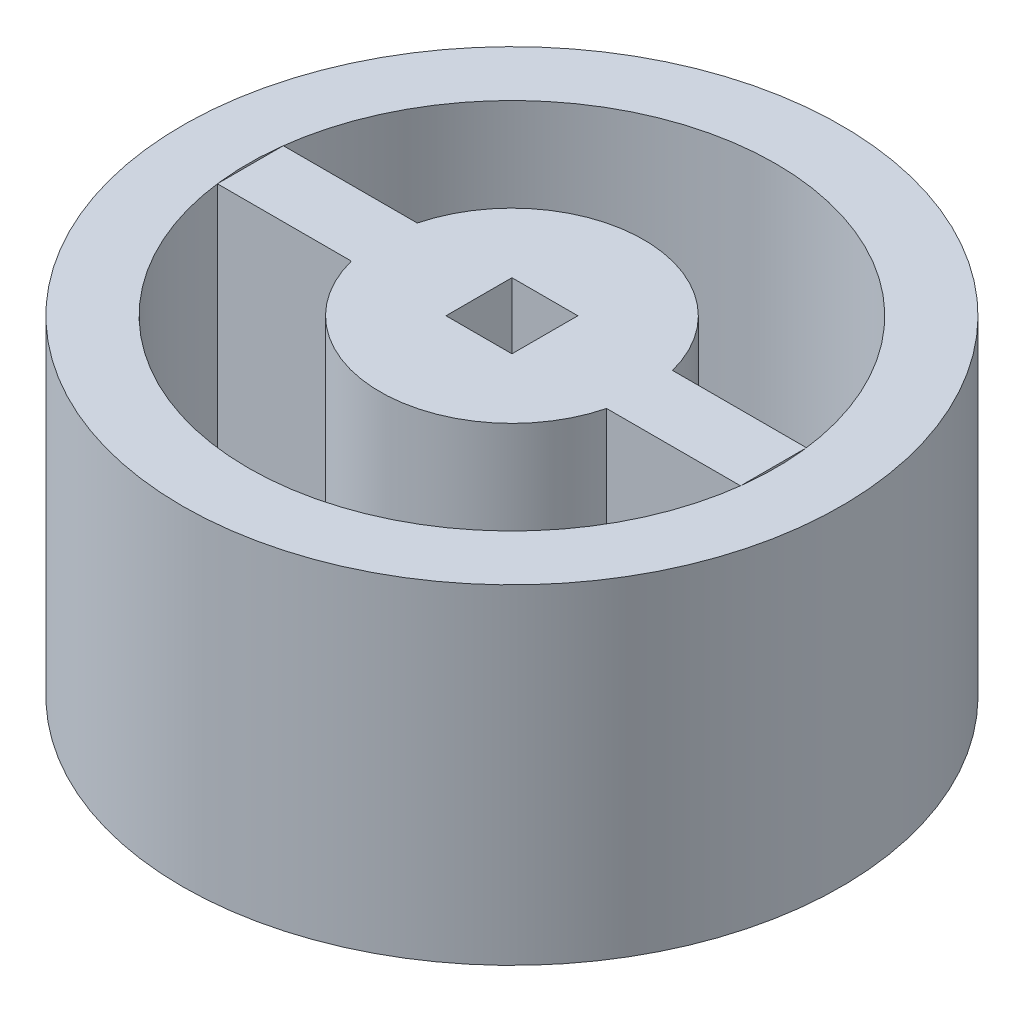
ISO-10303-21;
HEADER;
FILE_DESCRIPTION(('STEP AP214'),'2;1');
FILE_NAME('part.step','',(''),(''),'','','');
FILE_SCHEMA(('AUTOMOTIVE_DESIGN { 1 0 10303 214 1 1 1 1 }'));
ENDSEC;
DATA;
#1=APPLICATION_CONTEXT('core data for automotive mechanical design processes');
#2=APPLICATION_PROTOCOL_DEFINITION('international standard','automotive_design',2000,#1);
#3=PRODUCT_CONTEXT('',#1,'mechanical');
#4=PRODUCT('Part','Part','',(#3));
#5=PRODUCT_RELATED_PRODUCT_CATEGORY('part','',(#4));
#6=PRODUCT_DEFINITION_FORMATION('','',#4);
#7=PRODUCT_DEFINITION_CONTEXT('part definition',#1,'design');
#8=PRODUCT_DEFINITION('design','',#6,#7);
#9=PRODUCT_DEFINITION_SHAPE('','',#8);
#10=(LENGTH_UNIT() NAMED_UNIT(*) SI_UNIT(.MILLI.,.METRE.));
#11=(NAMED_UNIT(*) PLANE_ANGLE_UNIT() SI_UNIT($,.RADIAN.));
#12=(NAMED_UNIT(*) SI_UNIT($,.STERADIAN.) SOLID_ANGLE_UNIT());
#13=UNCERTAINTY_MEASURE_WITH_UNIT(LENGTH_MEASURE(1.E-05),#10,'distance_accuracy_value','');
#14=(GEOMETRIC_REPRESENTATION_CONTEXT(3) GLOBAL_UNCERTAINTY_ASSIGNED_CONTEXT((#13)) GLOBAL_UNIT_ASSIGNED_CONTEXT((#10,
#11,#12)) REPRESENTATION_CONTEXT('',''));
#15=CARTESIAN_POINT('',(0.,0.,0.));
#16=DIRECTION('',(0.,0.,1.));
#17=DIRECTION('',(1.,0.,0.));
#18=AXIS2_PLACEMENT_3D('',#15,#16,#17);
#19=CARTESIAN_POINT('',(0.,5.,0.));
#20=DIRECTION('',(0.,1.,0.));
#21=DIRECTION('',(0.,0.,1.));
#22=AXIS2_PLACEMENT_3D('',#19,#20,#21);
#23=PLANE('',#22);
#24=CARTESIAN_POINT('',(0.,5.,0.));
#25=DIRECTION('',(0.,-1.,0.));
#26=DIRECTION('',(0.,0.,-1.));
#27=AXIS2_PLACEMENT_3D('',#24,#25,#26);
#28=CIRCLE('',#27,4.);
#29=CARTESIAN_POINT('',(0.,5.,-4.));
#30=VERTEX_POINT('',#29);
#31=EDGE_CURVE('E51',#30,#30,#28,.T.);
#32=ORIENTED_EDGE('',*,*,#31,.T.);
#33=EDGE_LOOP('',(#32));
#34=FACE_BOUND('',#33,.T.);
#35=CARTESIAN_POINT('',(0.,5.,0.));
#36=DIRECTION('',(0.,1.,0.));
#37=DIRECTION('',(0.,0.,1.));
#38=AXIS2_PLACEMENT_3D('',#35,#36,#37);
#39=CIRCLE('',#38,5.);
#40=CARTESIAN_POINT('',(0.,5.,5.));
#41=VERTEX_POINT('',#40);
#42=EDGE_CURVE('E62',#41,#41,#39,.T.);
#43=ORIENTED_EDGE('',*,*,#42,.T.);
#44=EDGE_LOOP('',(#43));
#45=FACE_BOUND('',#44,.T.);
#46=ADVANCED_FACE('F47',(#34,#45),#23,.T.);
#47=CARTESIAN_POINT('',(0.,0.,0.));
#48=DIRECTION('',(0.,1.,0.));
#49=DIRECTION('',(0.,0.,1.));
#50=AXIS2_PLACEMENT_3D('',#47,#48,#49);
#51=PLANE('',#50);
#52=CARTESIAN_POINT('',(0.,0.,0.));
#53=DIRECTION('',(0.,1.,0.));
#54=DIRECTION('',(0.,0.,1.));
#55=AXIS2_PLACEMENT_3D('',#52,#53,#54);
#56=CIRCLE('',#55,4.);
#57=CARTESIAN_POINT('',(0.,0.,4.));
#58=VERTEX_POINT('',#57);
#59=EDGE_CURVE('E56',#58,#58,#56,.T.);
#60=ORIENTED_EDGE('',*,*,#59,.T.);
#61=EDGE_LOOP('',(#60));
#62=FACE_BOUND('',#61,.T.);
#63=CARTESIAN_POINT('',(0.,0.,0.));
#64=DIRECTION('',(0.,1.,0.));
#65=DIRECTION('',(0.,0.,1.));
#66=AXIS2_PLACEMENT_3D('',#63,#64,#65);
#67=CIRCLE('',#66,5.);
#68=CARTESIAN_POINT('',(0.,0.,5.));
#69=VERTEX_POINT('',#68);
#70=EDGE_CURVE('E11',#69,#69,#67,.T.);
#71=ORIENTED_EDGE('',*,*,#70,.F.);
#72=EDGE_LOOP('',(#71));
#73=FACE_BOUND('',#72,.T.);
#74=ADVANCED_FACE('F49',(#62,#73),#51,.F.);
#75=CARTESIAN_POINT('',(0.,5.,0.));
#76=DIRECTION('',(0.,-1.,0.));
#77=DIRECTION('',(0.,0.,-1.));
#78=AXIS2_PLACEMENT_3D('',#75,#76,#77);
#79=CYLINDRICAL_SURFACE('',#78,5.);
#80=ORIENTED_EDGE('',*,*,#42,.F.);
#81=EDGE_LOOP('',(#80));
#82=FACE_BOUND('',#81,.T.);
#83=ORIENTED_EDGE('',*,*,#70,.T.);
#84=EDGE_LOOP('',(#83));
#85=FACE_BOUND('',#84,.T.);
#86=ADVANCED_FACE('F75',(#82,#85),#79,.T.);
#87=CARTESIAN_POINT('',(0.,5.,0.));
#88=DIRECTION('',(0.,-1.,0.));
#89=DIRECTION('',(0.,0.,-1.));
#90=AXIS2_PLACEMENT_3D('',#87,#88,#89);
#91=CYLINDRICAL_SURFACE('',#90,4.);
#92=ORIENTED_EDGE('',*,*,#59,.F.);
#93=EDGE_LOOP('',(#92));
#94=FACE_BOUND('',#93,.T.);
#95=ORIENTED_EDGE('',*,*,#31,.F.);
#96=EDGE_LOOP('',(#95));
#97=FACE_BOUND('',#96,.T.);
#98=ADVANCED_FACE('F73',(#94,#97),#91,.F.);
#99=CLOSED_SHELL('',(#46,#74,#86,#98));
#100=MANIFOLD_SOLID_BREP('B2',#99);
#101=CARTESIAN_POINT('',(-3.96862696659689,0.,0.5));
#102=DIRECTION('',(0.,0.,1.));
#103=DIRECTION('',(1.,0.,0.));
#104=AXIS2_PLACEMENT_3D('',#101,#102,#103);
#105=PLANE('',#104);
#106=DIRECTION('',(1.,0.,0.));
#107=VECTOR('',#106,1.);
#108=CARTESIAN_POINT('',(-3.96862696659689,0.,0.5));
#109=LINE('',#108,#107);
#110=CARTESIAN_POINT('',(-3.96862696659689,0.,0.5));
#111=VERTEX_POINT('',#110);
#112=CARTESIAN_POINT('',(-1.93649167310371,0.,0.5));
#113=VERTEX_POINT('',#112);
#114=EDGE_CURVE('E244',#111,#113,#109,.T.);
#115=ORIENTED_EDGE('',*,*,#114,.T.);
#116=DIRECTION('',(0.,-1.,0.));
#117=VECTOR('',#116,1.);
#118=CARTESIAN_POINT('',(-1.93649167310371,5.,0.5));
#119=LINE('',#118,#117);
#120=CARTESIAN_POINT('',(-1.93649167310371,5.,0.5));
#121=VERTEX_POINT('',#120);
#122=EDGE_CURVE('E45',#113,#121,#119,.F.);
#123=ORIENTED_EDGE('',*,*,#122,.T.);
#124=DIRECTION('',(1.,0.,0.));
#125=VECTOR('',#124,1.);
#126=CARTESIAN_POINT('',(-3.96862696659689,5.,0.5));
#127=LINE('',#126,#125);
#128=CARTESIAN_POINT('',(-3.96862696659689,5.,0.5));
#129=VERTEX_POINT('',#128);
#130=EDGE_CURVE('E236',#129,#121,#127,.T.);
#131=ORIENTED_EDGE('',*,*,#130,.F.);
#132=DIRECTION('',(0.,1.,0.));
#133=VECTOR('',#132,1.);
#134=CARTESIAN_POINT('',(-3.96862696659689,0.,0.5));
#135=LINE('',#134,#133);
#136=EDGE_CURVE('E264',#111,#129,#135,.T.);
#137=ORIENTED_EDGE('',*,*,#136,.F.);
#138=EDGE_LOOP('',(#115,#123,#131,#137));
#139=FACE_BOUND('',#138,.T.);
#140=ADVANCED_FACE('F107',(#139),#105,.T.);
#141=CARTESIAN_POINT('',(-3.96862696659689,0.,0.5));
#142=DIRECTION('',(-1.,0.,0.));
#143=DIRECTION('',(0.,0.,1.));
#144=AXIS2_PLACEMENT_3D('',#141,#142,#143);
#145=PLANE('',#144);
#146=DIRECTION('',(0.,0.,1.));
#147=VECTOR('',#146,1.);
#148=CARTESIAN_POINT('',(-3.96862696659689,5.,0.5));
#149=LINE('',#148,#147);
#150=CARTESIAN_POINT('',(-3.96862696659689,5.,-0.5));
#151=VERTEX_POINT('',#150);
#152=EDGE_CURVE('E254',#151,#129,#149,.T.);
#153=ORIENTED_EDGE('',*,*,#152,.F.);
#154=DIRECTION('',(0.,1.,0.));
#155=VECTOR('',#154,1.);
#156=CARTESIAN_POINT('',(-3.96862696659689,0.,-0.5));
#157=LINE('',#156,#155);
#158=CARTESIAN_POINT('',(-3.96862696659689,0.,-0.5));
#159=VERTEX_POINT('',#158);
#160=EDGE_CURVE('E266',#159,#151,#157,.T.);
#161=ORIENTED_EDGE('',*,*,#160,.F.);
#162=DIRECTION('',(0.,0.,1.));
#163=VECTOR('',#162,1.);
#164=CARTESIAN_POINT('',(-3.96862696659689,0.,0.5));
#165=LINE('',#164,#163);
#166=EDGE_CURVE('E240',#159,#111,#165,.T.);
#167=ORIENTED_EDGE('',*,*,#166,.T.);
#168=ORIENTED_EDGE('',*,*,#136,.T.);
#169=EDGE_LOOP('',(#153,#161,#167,#168));
#170=FACE_BOUND('',#169,.T.);
#171=ADVANCED_FACE('F307',(#170),#145,.T.);
#172=CARTESIAN_POINT('',(-3.96862696659689,0.,-0.5));
#173=DIRECTION('',(0.,0.,-1.));
#174=DIRECTION('',(-1.,0.,0.));
#175=AXIS2_PLACEMENT_3D('',#172,#173,#174);
#176=PLANE('',#175);
#177=DIRECTION('',(-1.,0.,0.));
#178=VECTOR('',#177,1.);
#179=CARTESIAN_POINT('',(-3.96862696659689,5.,-0.5));
#180=LINE('',#179,#178);
#181=CARTESIAN_POINT('',(-1.93649167310371,5.,-0.5));
#182=VERTEX_POINT('',#181);
#183=EDGE_CURVE('E250',#182,#151,#180,.T.);
#184=ORIENTED_EDGE('',*,*,#183,.F.);
#185=DIRECTION('',(0.,-1.,0.));
#186=VECTOR('',#185,1.);
#187=CARTESIAN_POINT('',(-1.93649167310371,5.,-0.5));
#188=LINE('',#187,#186);
#189=CARTESIAN_POINT('',(-1.93649167310371,0.,-0.5));
#190=VERTEX_POINT('',#189);
#191=EDGE_CURVE('E275',#182,#190,#188,.T.);
#192=ORIENTED_EDGE('',*,*,#191,.T.);
#193=DIRECTION('',(-1.,0.,0.));
#194=VECTOR('',#193,1.);
#195=CARTESIAN_POINT('',(-3.96862696659689,0.,-0.5));
#196=LINE('',#195,#194);
#197=EDGE_CURVE('E235',#190,#159,#196,.T.);
#198=ORIENTED_EDGE('',*,*,#197,.T.);
#199=ORIENTED_EDGE('',*,*,#160,.T.);
#200=EDGE_LOOP('',(#184,#192,#198,#199));
#201=FACE_BOUND('',#200,.T.);
#202=ADVANCED_FACE('F310',(#201),#176,.T.);
#203=CARTESIAN_POINT('',(0.,5.,0.));
#204=DIRECTION('',(0.,-1.,0.));
#205=DIRECTION('',(0.,0.,-1.));
#206=AXIS2_PLACEMENT_3D('',#203,#204,#205);
#207=CYLINDRICAL_SURFACE('',#206,2.);
#208=ORIENTED_EDGE('',*,*,#122,.F.);
#209=CARTESIAN_POINT('',(0.,0.,0.));
#210=DIRECTION('',(0.,1.,0.));
#211=DIRECTION('',(0.,0.,1.));
#212=AXIS2_PLACEMENT_3D('',#209,#210,#211);
#213=CIRCLE('',#212,2.);
#214=CARTESIAN_POINT('',(1.93649167310371,0.,0.5));
#215=VERTEX_POINT('',#214);
#216=EDGE_CURVE('E272',#113,#215,#213,.T.);
#217=ORIENTED_EDGE('',*,*,#216,.T.);
#218=DIRECTION('',(0.,-1.,0.));
#219=VECTOR('',#218,1.);
#220=CARTESIAN_POINT('',(1.93649167310371,5.,0.5));
#221=LINE('',#220,#219);
#222=CARTESIAN_POINT('',(1.93649167310371,5.,0.5));
#223=VERTEX_POINT('',#222);
#224=EDGE_CURVE('E115',#223,#215,#221,.T.);
#225=ORIENTED_EDGE('',*,*,#224,.F.);
#226=CARTESIAN_POINT('',(0.,5.,0.));
#227=DIRECTION('',(0.,-1.,0.));
#228=DIRECTION('',(0.,0.,-1.));
#229=AXIS2_PLACEMENT_3D('',#226,#227,#228);
#230=CIRCLE('',#229,2.);
#231=EDGE_CURVE('E271',#223,#121,#230,.T.);
#232=ORIENTED_EDGE('',*,*,#231,.T.);
#233=EDGE_LOOP('',(#208,#217,#225,#232));
#234=FACE_BOUND('',#233,.T.);
#235=ADVANCED_FACE('F300',(#234),#207,.T.);
#236=CARTESIAN_POINT('',(0.,5.,0.));
#237=DIRECTION('',(0.,1.,0.));
#238=DIRECTION('',(0.,0.,1.));
#239=AXIS2_PLACEMENT_3D('',#236,#237,#238);
#240=PLANE('',#239);
#241=DIRECTION('',(0.,0.,-1.));
#242=VECTOR('',#241,1.);
#243=CARTESIAN_POINT('',(0.5,5.,0.));
#244=LINE('',#243,#242);
#245=CARTESIAN_POINT('',(0.5,5.,0.5));
#246=VERTEX_POINT('',#245);
#247=CARTESIAN_POINT('',(0.5,5.,-0.5));
#248=VERTEX_POINT('',#247);
#249=EDGE_CURVE('E202',#246,#248,#244,.T.);
#250=ORIENTED_EDGE('',*,*,#249,.F.);
#251=DIRECTION('',(1.,0.,0.));
#252=VECTOR('',#251,1.);
#253=CARTESIAN_POINT('',(0.,5.,0.5));
#254=LINE('',#253,#252);
#255=CARTESIAN_POINT('',(-0.5,5.,0.5));
#256=VERTEX_POINT('',#255);
#257=EDGE_CURVE('E228',#256,#246,#254,.T.);
#258=ORIENTED_EDGE('',*,*,#257,.F.);
#259=DIRECTION('',(0.,0.,1.));
#260=VECTOR('',#259,1.);
#261=CARTESIAN_POINT('',(-0.5,5.,0.));
#262=LINE('',#261,#260);
#263=CARTESIAN_POINT('',(-0.5,5.,-0.5));
#264=VERTEX_POINT('',#263);
#265=EDGE_CURVE('E226',#264,#256,#262,.T.);
#266=ORIENTED_EDGE('',*,*,#265,.F.);
#267=DIRECTION('',(-1.,0.,0.));
#268=VECTOR('',#267,1.);
#269=CARTESIAN_POINT('',(0.,5.,-0.5));
#270=LINE('',#269,#268);
#271=EDGE_CURVE('E220',#248,#264,#270,.T.);
#272=ORIENTED_EDGE('',*,*,#271,.F.);
#273=EDGE_LOOP('',(#250,#258,#266,#272));
#274=FACE_BOUND('',#273,.T.);
#275=ORIENTED_EDGE('',*,*,#130,.T.);
#276=ORIENTED_EDGE('',*,*,#231,.F.);
#277=CARTESIAN_POINT('',(3.96862696659689,5.,0.5));
#278=VERTEX_POINT('',#277);
#279=EDGE_CURVE('E257',#223,#278,#127,.T.);
#280=ORIENTED_EDGE('',*,*,#279,.T.);
#281=DIRECTION('',(0.,0.,-1.));
#282=VECTOR('',#281,1.);
#283=CARTESIAN_POINT('',(3.96862696659689,5.,0.5));
#284=LINE('',#283,#282);
#285=CARTESIAN_POINT('',(3.96862696659689,5.,-0.5));
#286=VERTEX_POINT('',#285);
#287=EDGE_CURVE('E231',#278,#286,#284,.T.);
#288=ORIENTED_EDGE('',*,*,#287,.T.);
#289=CARTESIAN_POINT('',(1.93649167310371,5.,-0.5));
#290=VERTEX_POINT('',#289);
#291=EDGE_CURVE('E251',#286,#290,#180,.T.);
#292=ORIENTED_EDGE('',*,*,#291,.T.);
#293=EDGE_CURVE('E263',#182,#290,#230,.T.);
#294=ORIENTED_EDGE('',*,*,#293,.F.);
#295=ORIENTED_EDGE('',*,*,#183,.T.);
#296=ORIENTED_EDGE('',*,*,#152,.T.);
#297=EDGE_LOOP('',(#275,#276,#280,#288,#292,#294,#295,#296));
#298=FACE_BOUND('',#297,.T.);
#299=ADVANCED_FACE('F298',(#274,#298),#240,.T.);
#300=CARTESIAN_POINT('',(0.,0.,0.));
#301=DIRECTION('',(0.,1.,0.));
#302=DIRECTION('',(0.,0.,1.));
#303=AXIS2_PLACEMENT_3D('',#300,#301,#302);
#304=PLANE('',#303);
#305=DIRECTION('',(1.,0.,0.));
#306=VECTOR('',#305,1.);
#307=CARTESIAN_POINT('',(-0.5,0.,0.5));
#308=LINE('',#307,#306);
#309=CARTESIAN_POINT('',(-0.5,0.,0.5));
#310=VERTEX_POINT('',#309);
#311=CARTESIAN_POINT('',(0.5,0.,0.5));
#312=VERTEX_POINT('',#311);
#313=EDGE_CURVE('E205',#310,#312,#308,.T.);
#314=ORIENTED_EDGE('',*,*,#313,.T.);
#315=DIRECTION('',(0.,0.,-1.));
#316=VECTOR('',#315,1.);
#317=CARTESIAN_POINT('',(0.5,0.,0.5));
#318=LINE('',#317,#316);
#319=CARTESIAN_POINT('',(0.5,0.,-0.5));
#320=VERTEX_POINT('',#319);
#321=EDGE_CURVE('E199',#312,#320,#318,.T.);
#322=ORIENTED_EDGE('',*,*,#321,.T.);
#323=DIRECTION('',(-1.,0.,0.));
#324=VECTOR('',#323,1.);
#325=CARTESIAN_POINT('',(-0.5,0.,-0.5));
#326=LINE('',#325,#324);
#327=CARTESIAN_POINT('',(-0.5,0.,-0.5));
#328=VERTEX_POINT('',#327);
#329=EDGE_CURVE('E208',#320,#328,#326,.T.);
#330=ORIENTED_EDGE('',*,*,#329,.T.);
#331=DIRECTION('',(0.,0.,1.));
#332=VECTOR('',#331,1.);
#333=CARTESIAN_POINT('',(-0.5,0.,0.5));
#334=LINE('',#333,#332);
#335=EDGE_CURVE('E130',#328,#310,#334,.T.);
#336=ORIENTED_EDGE('',*,*,#335,.T.);
#337=EDGE_LOOP('',(#314,#322,#330,#336));
#338=FACE_BOUND('',#337,.T.);
#339=CARTESIAN_POINT('',(1.93649167310371,0.,-0.5));
#340=VERTEX_POINT('',#339);
#341=EDGE_CURVE('E274',#340,#190,#213,.T.);
#342=ORIENTED_EDGE('',*,*,#341,.F.);
#343=CARTESIAN_POINT('',(3.96862696659689,0.,-0.5));
#344=VERTEX_POINT('',#343);
#345=EDGE_CURVE('E237',#344,#340,#196,.T.);
#346=ORIENTED_EDGE('',*,*,#345,.F.);
#347=DIRECTION('',(0.,0.,-1.));
#348=VECTOR('',#347,1.);
#349=CARTESIAN_POINT('',(3.96862696659689,0.,0.5));
#350=LINE('',#349,#348);
#351=CARTESIAN_POINT('',(3.96862696659689,0.,0.5));
#352=VERTEX_POINT('',#351);
#353=EDGE_CURVE('E232',#352,#344,#350,.T.);
#354=ORIENTED_EDGE('',*,*,#353,.F.);
#355=EDGE_CURVE('E243',#215,#352,#109,.T.);
#356=ORIENTED_EDGE('',*,*,#355,.F.);
#357=ORIENTED_EDGE('',*,*,#216,.F.);
#358=ORIENTED_EDGE('',*,*,#114,.F.);
#359=ORIENTED_EDGE('',*,*,#166,.F.);
#360=ORIENTED_EDGE('',*,*,#197,.F.);
#361=EDGE_LOOP('',(#342,#346,#354,#356,#357,#358,#359,#360));
#362=FACE_BOUND('',#361,.T.);
#363=ADVANCED_FACE('F109',(#338,#362),#304,.F.);
#364=DIRECTION('',(0.,-1.,0.));
#365=VECTOR('',#364,1.);
#366=CARTESIAN_POINT('',(1.93649167310371,5.,-0.5));
#367=LINE('',#366,#365);
#368=EDGE_CURVE('E278',#340,#290,#367,.F.);
#369=ORIENTED_EDGE('',*,*,#368,.F.);
#370=ORIENTED_EDGE('',*,*,#341,.T.);
#371=ORIENTED_EDGE('',*,*,#191,.F.);
#372=ORIENTED_EDGE('',*,*,#293,.T.);
#373=EDGE_LOOP('',(#369,#370,#371,#372));
#374=FACE_BOUND('',#373,.T.);
#375=ADVANCED_FACE('F313',(#374),#207,.T.);
#376=CARTESIAN_POINT('',(3.96862696659689,0.,0.5));
#377=DIRECTION('',(1.,0.,0.));
#378=DIRECTION('',(0.,0.,-1.));
#379=AXIS2_PLACEMENT_3D('',#376,#377,#378);
#380=PLANE('',#379);
#381=ORIENTED_EDGE('',*,*,#287,.F.);
#382=DIRECTION('',(0.,1.,0.));
#383=VECTOR('',#382,1.);
#384=CARTESIAN_POINT('',(3.96862696659689,0.,0.5));
#385=LINE('',#384,#383);
#386=EDGE_CURVE('E260',#352,#278,#385,.T.);
#387=ORIENTED_EDGE('',*,*,#386,.F.);
#388=ORIENTED_EDGE('',*,*,#353,.T.);
#389=DIRECTION('',(0.,1.,0.));
#390=VECTOR('',#389,1.);
#391=CARTESIAN_POINT('',(3.96862696659689,0.,-0.5));
#392=LINE('',#391,#390);
#393=EDGE_CURVE('E247',#344,#286,#392,.T.);
#394=ORIENTED_EDGE('',*,*,#393,.T.);
#395=EDGE_LOOP('',(#381,#387,#388,#394));
#396=FACE_BOUND('',#395,.T.);
#397=ADVANCED_FACE('F295',(#396),#380,.T.);
#398=ORIENTED_EDGE('',*,*,#345,.T.);
#399=ORIENTED_EDGE('',*,*,#368,.T.);
#400=ORIENTED_EDGE('',*,*,#291,.F.);
#401=ORIENTED_EDGE('',*,*,#393,.F.);
#402=EDGE_LOOP('',(#398,#399,#400,#401));
#403=FACE_BOUND('',#402,.T.);
#404=ADVANCED_FACE('F315',(#403),#176,.T.);
#405=ORIENTED_EDGE('',*,*,#279,.F.);
#406=ORIENTED_EDGE('',*,*,#224,.T.);
#407=ORIENTED_EDGE('',*,*,#355,.T.);
#408=ORIENTED_EDGE('',*,*,#386,.T.);
#409=EDGE_LOOP('',(#405,#406,#407,#408));
#410=FACE_BOUND('',#409,.T.);
#411=ADVANCED_FACE('F285',(#410),#105,.T.);
#412=CARTESIAN_POINT('',(0.5,0.,0.5));
#413=DIRECTION('',(1.,0.,0.));
#414=DIRECTION('',(0.,0.,-1.));
#415=AXIS2_PLACEMENT_3D('',#412,#413,#414);
#416=PLANE('',#415);
#417=ORIENTED_EDGE('',*,*,#249,.T.);
#418=DIRECTION('',(0.,1.,0.));
#419=VECTOR('',#418,1.);
#420=CARTESIAN_POINT('',(0.5,0.,-0.5));
#421=LINE('',#420,#419);
#422=EDGE_CURVE('E122',#320,#248,#421,.T.);
#423=ORIENTED_EDGE('',*,*,#422,.F.);
#424=ORIENTED_EDGE('',*,*,#321,.F.);
#425=DIRECTION('',(0.,1.,0.));
#426=VECTOR('',#425,1.);
#427=CARTESIAN_POINT('',(0.5,0.,0.5));
#428=LINE('',#427,#426);
#429=EDGE_CURVE('E218',#312,#246,#428,.T.);
#430=ORIENTED_EDGE('',*,*,#429,.T.);
#431=EDGE_LOOP('',(#417,#423,#424,#430));
#432=FACE_BOUND('',#431,.T.);
#433=ADVANCED_FACE('F196',(#432),#416,.F.);
#434=CARTESIAN_POINT('',(-0.5,0.,0.5));
#435=DIRECTION('',(0.,0.,1.));
#436=DIRECTION('',(1.,0.,0.));
#437=AXIS2_PLACEMENT_3D('',#434,#435,#436);
#438=PLANE('',#437);
#439=ORIENTED_EDGE('',*,*,#257,.T.);
#440=ORIENTED_EDGE('',*,*,#429,.F.);
#441=ORIENTED_EDGE('',*,*,#313,.F.);
#442=DIRECTION('',(0.,1.,0.));
#443=VECTOR('',#442,1.);
#444=CARTESIAN_POINT('',(-0.5,0.,0.5));
#445=LINE('',#444,#443);
#446=EDGE_CURVE('E221',#310,#256,#445,.T.);
#447=ORIENTED_EDGE('',*,*,#446,.T.);
#448=EDGE_LOOP('',(#439,#440,#441,#447));
#449=FACE_BOUND('',#448,.T.);
#450=ADVANCED_FACE('F333',(#449),#438,.F.);
#451=CARTESIAN_POINT('',(-0.5,0.,0.5));
#452=DIRECTION('',(-1.,0.,0.));
#453=DIRECTION('',(0.,0.,1.));
#454=AXIS2_PLACEMENT_3D('',#451,#452,#453);
#455=PLANE('',#454);
#456=ORIENTED_EDGE('',*,*,#265,.T.);
#457=ORIENTED_EDGE('',*,*,#446,.F.);
#458=ORIENTED_EDGE('',*,*,#335,.F.);
#459=DIRECTION('',(0.,1.,0.));
#460=VECTOR('',#459,1.);
#461=CARTESIAN_POINT('',(-0.5,0.,-0.5));
#462=LINE('',#461,#460);
#463=EDGE_CURVE('E204',#328,#264,#462,.T.);
#464=ORIENTED_EDGE('',*,*,#463,.T.);
#465=EDGE_LOOP('',(#456,#457,#458,#464));
#466=FACE_BOUND('',#465,.T.);
#467=ADVANCED_FACE('F336',(#466),#455,.F.);
#468=CARTESIAN_POINT('',(-0.5,0.,-0.5));
#469=DIRECTION('',(0.,0.,-1.));
#470=DIRECTION('',(-1.,0.,0.));
#471=AXIS2_PLACEMENT_3D('',#468,#469,#470);
#472=PLANE('',#471);
#473=ORIENTED_EDGE('',*,*,#271,.T.);
#474=ORIENTED_EDGE('',*,*,#463,.F.);
#475=ORIENTED_EDGE('',*,*,#329,.F.);
#476=ORIENTED_EDGE('',*,*,#422,.T.);
#477=EDGE_LOOP('',(#473,#474,#475,#476));
#478=FACE_BOUND('',#477,.T.);
#479=ADVANCED_FACE('F209',(#478),#472,.F.);
#480=CLOSED_SHELL('',(#140,#171,#202,#235,#299,#363,#375,#397,#404,#411,#433,#450,#467,#479));
#481=MANIFOLD_SOLID_BREP('B6',#480);
#482=ADVANCED_BREP_SHAPE_REPRESENTATION('',(#18,#100,#481),#14);
#483=SHAPE_DEFINITION_REPRESENTATION(#9,#482);
ENDSEC;
END-ISO-10303-21;
